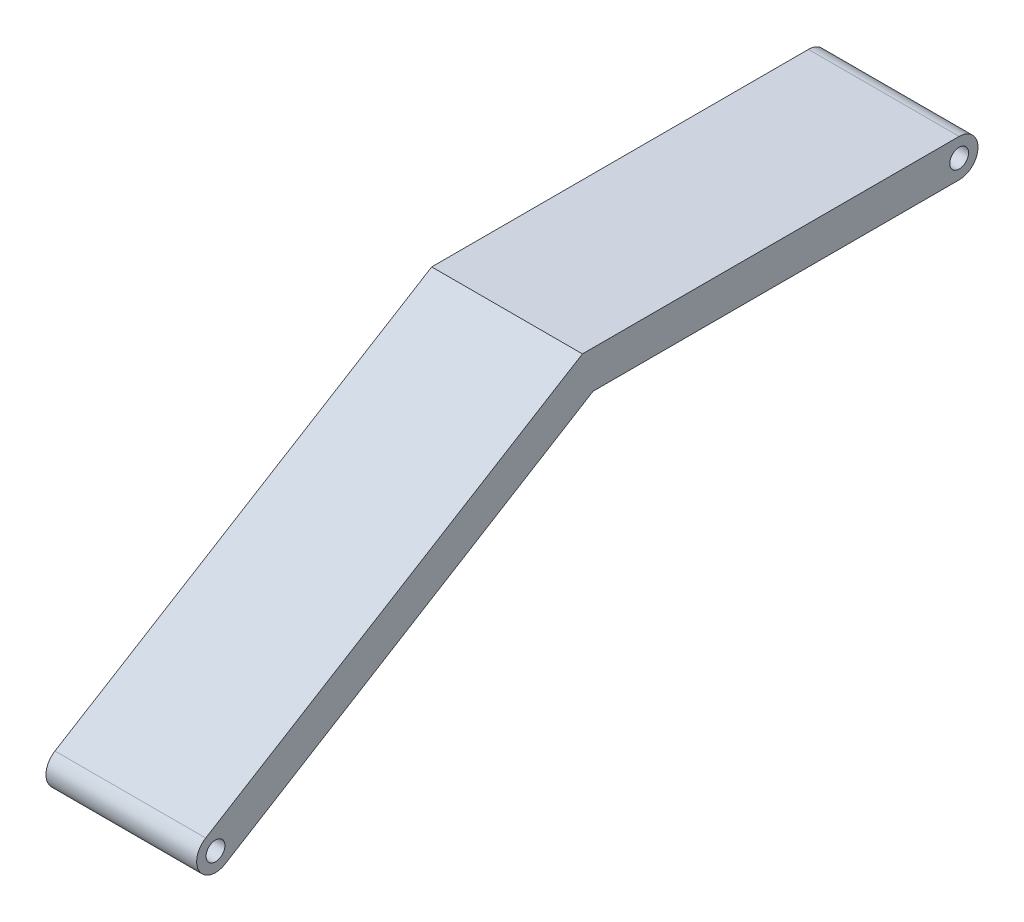
ISO-10303-21;
HEADER;
FILE_DESCRIPTION(('STEP AP214'),'2;1');
FILE_NAME('part.step','',(''),(''),'','','');
FILE_SCHEMA(('AUTOMOTIVE_DESIGN { 1 0 10303 214 1 1 1 1 }'));
ENDSEC;
DATA;
#1=APPLICATION_CONTEXT('core data for automotive mechanical design processes');
#2=APPLICATION_PROTOCOL_DEFINITION('international standard','automotive_design',2000,#1);
#3=PRODUCT_CONTEXT('',#1,'mechanical');
#4=PRODUCT('Part','Part','',(#3));
#5=PRODUCT_RELATED_PRODUCT_CATEGORY('part','',(#4));
#6=PRODUCT_DEFINITION_FORMATION('','',#4);
#7=PRODUCT_DEFINITION_CONTEXT('part definition',#1,'design');
#8=PRODUCT_DEFINITION('design','',#6,#7);
#9=PRODUCT_DEFINITION_SHAPE('','',#8);
#10=(LENGTH_UNIT() NAMED_UNIT(*) SI_UNIT(.MILLI.,.METRE.));
#11=(NAMED_UNIT(*) PLANE_ANGLE_UNIT() SI_UNIT($,.RADIAN.));
#12=(NAMED_UNIT(*) SI_UNIT($,.STERADIAN.) SOLID_ANGLE_UNIT());
#13=UNCERTAINTY_MEASURE_WITH_UNIT(LENGTH_MEASURE(1.E-05),#10,'distance_accuracy_value','');
#14=(GEOMETRIC_REPRESENTATION_CONTEXT(3) GLOBAL_UNCERTAINTY_ASSIGNED_CONTEXT((#13)) GLOBAL_UNIT_ASSIGNED_CONTEXT((#10,
#11,#12)) REPRESENTATION_CONTEXT('',''));
#15=CARTESIAN_POINT('',(0.,0.,0.));
#16=DIRECTION('',(0.,0.,1.));
#17=DIRECTION('',(1.,0.,0.));
#18=AXIS2_PLACEMENT_3D('',#15,#16,#17);
#19=CARTESIAN_POINT('',(4.,1.76861328752902,4.3260448331332));
#20=DIRECTION('',(0.,1.,0.));
#21=DIRECTION('',(0.,0.,1.));
#22=AXIS2_PLACEMENT_3D('',#19,#20,#21);
#23=PLANE('',#22);
#24=DIRECTION('',(0.,0.,-1.));
#25=VECTOR('',#24,1.);
#26=CARTESIAN_POINT('',(0.,1.76861328752902,4.3260448331332));
#27=LINE('',#26,#25);
#28=CARTESIAN_POINT('',(0.,1.76861328752902,4.3260448331332));
#29=VERTEX_POINT('',#28);
#30=CARTESIAN_POINT('',(0.,1.76861328752902,-5.67395516686681));
#31=VERTEX_POINT('',#30);
#32=EDGE_CURVE('E89',#29,#31,#27,.T.);
#33=ORIENTED_EDGE('',*,*,#32,.F.);
#34=DIRECTION('',(-1.,0.,0.));
#35=VECTOR('',#34,1.);
#36=CARTESIAN_POINT('',(4.,1.76861328752902,4.3260448331332));
#37=LINE('',#36,#35);
#38=CARTESIAN_POINT('',(4.,1.76861328752902,4.3260448331332));
#39=VERTEX_POINT('',#38);
#40=EDGE_CURVE('E49',#39,#29,#37,.T.);
#41=ORIENTED_EDGE('',*,*,#40,.F.);
#42=DIRECTION('',(0.,0.,-1.));
#43=VECTOR('',#42,1.);
#44=CARTESIAN_POINT('',(4.,1.76861328752902,4.3260448331332));
#45=LINE('',#44,#43);
#46=CARTESIAN_POINT('',(4.,1.76861328752902,-5.67395516686681));
#47=VERTEX_POINT('',#46);
#48=EDGE_CURVE('E108',#39,#47,#45,.T.);
#49=ORIENTED_EDGE('',*,*,#48,.T.);
#50=DIRECTION('',(-1.,0.,0.));
#51=VECTOR('',#50,1.);
#52=CARTESIAN_POINT('',(4.,1.76861328752902,-5.67395516686681));
#53=LINE('',#52,#51);
#54=EDGE_CURVE('E11',#47,#31,#53,.T.);
#55=ORIENTED_EDGE('',*,*,#54,.T.);
#56=EDGE_LOOP('',(#33,#41,#49,#55));
#57=FACE_BOUND('',#56,.T.);
#58=ADVANCED_FACE('F39',(#57),#23,.T.);
#59=CARTESIAN_POINT('',(4.,-4.35978996680547,14.3260448331332));
#60=DIRECTION('',(0.,0.852625145868333,0.522523071866691));
#61=DIRECTION('',(0.,-0.522523071866691,0.852625145868333));
#62=AXIS2_PLACEMENT_3D('',#59,#60,#61);
#63=PLANE('',#62);
#64=DIRECTION('',(0.,0.522523071866691,-0.852625145868333));
#65=VECTOR('',#64,1.);
#66=CARTESIAN_POINT('',(0.,-4.35978996680547,14.3260448331332));
#67=LINE('',#66,#65);
#68=CARTESIAN_POINT('',(0.,-4.35978996680547,14.3260448331332));
#69=VERTEX_POINT('',#68);
#70=EDGE_CURVE('E81',#69,#29,#67,.T.);
#71=ORIENTED_EDGE('',*,*,#70,.F.);
#72=DIRECTION('',(-1.,0.,0.));
#73=VECTOR('',#72,1.);
#74=CARTESIAN_POINT('',(4.,-4.35978996680547,14.3260448331332));
#75=LINE('',#74,#73);
#76=CARTESIAN_POINT('',(4.,-4.35978996680547,14.3260448331332));
#77=VERTEX_POINT('',#76);
#78=EDGE_CURVE('E85',#77,#69,#75,.T.);
#79=ORIENTED_EDGE('',*,*,#78,.F.);
#80=DIRECTION('',(0.,0.522523071866691,-0.852625145868333));
#81=VECTOR('',#80,1.);
#82=CARTESIAN_POINT('',(4.,-4.35978996680547,14.3260448331332));
#83=LINE('',#82,#81);
#84=EDGE_CURVE('E83',#77,#39,#83,.T.);
#85=ORIENTED_EDGE('',*,*,#84,.T.);
#86=ORIENTED_EDGE('',*,*,#40,.T.);
#87=EDGE_LOOP('',(#71,#79,#85,#86));
#88=FACE_BOUND('',#87,.T.);
#89=ADVANCED_FACE('F79',(#88),#63,.T.);
#90=CARTESIAN_POINT('',(4.,0.768613287529023,4.04400015019666));
#91=DIRECTION('',(0.,-0.852625145868333,-0.522523071866691));
#92=DIRECTION('',(0.,0.522523071866691,-0.852625145868333));
#93=AXIS2_PLACEMENT_3D('',#90,#91,#92);
#94=PLANE('',#93);
#95=DIRECTION('',(0.,-0.522523071866691,0.852625145868333));
#96=VECTOR('',#95,1.);
#97=CARTESIAN_POINT('',(0.,0.768613287529023,4.04400015019666));
#98=LINE('',#97,#96);
#99=CARTESIAN_POINT('',(0.,0.768613287529023,4.04400015019666));
#100=VERTEX_POINT('',#99);
#101=CARTESIAN_POINT('',(0.,-5.2124151126738,13.8035217612665));
#102=VERTEX_POINT('',#101);
#103=EDGE_CURVE('E90',#100,#102,#98,.T.);
#104=ORIENTED_EDGE('',*,*,#103,.F.);
#105=DIRECTION('',(-1.,0.,0.));
#106=VECTOR('',#105,1.);
#107=CARTESIAN_POINT('',(4.,0.768613287529023,4.04400015019666));
#108=LINE('',#107,#106);
#109=CARTESIAN_POINT('',(4.,0.768613287529023,4.04400015019666));
#110=VERTEX_POINT('',#109);
#111=EDGE_CURVE('E103',#110,#100,#108,.T.);
#112=ORIENTED_EDGE('',*,*,#111,.F.);
#113=DIRECTION('',(0.,-0.522523071866691,0.852625145868333));
#114=VECTOR('',#113,1.);
#115=CARTESIAN_POINT('',(4.,0.768613287529023,4.04400015019666));
#116=LINE('',#115,#114);
#117=CARTESIAN_POINT('',(4.,-5.2124151126738,13.8035217612665));
#118=VERTEX_POINT('',#117);
#119=EDGE_CURVE('E96',#110,#118,#116,.T.);
#120=ORIENTED_EDGE('',*,*,#119,.T.);
#121=DIRECTION('',(-1.,0.,0.));
#122=VECTOR('',#121,1.);
#123=CARTESIAN_POINT('',(4.,-5.2124151126738,13.8035217612665));
#124=LINE('',#123,#122);
#125=EDGE_CURVE('E101',#118,#102,#124,.T.);
#126=ORIENTED_EDGE('',*,*,#125,.T.);
#127=EDGE_LOOP('',(#104,#112,#120,#126));
#128=FACE_BOUND('',#127,.T.);
#129=ADVANCED_FACE('F125',(#128),#94,.T.);
#130=CARTESIAN_POINT('',(4.,0.768613287529024,-5.67395516686681));
#131=DIRECTION('',(0.,-1.,0.));
#132=DIRECTION('',(0.,0.,-1.));
#133=AXIS2_PLACEMENT_3D('',#130,#131,#132);
#134=PLANE('',#133);
#135=DIRECTION('',(0.,0.,1.));
#136=VECTOR('',#135,1.);
#137=CARTESIAN_POINT('',(0.,0.768613287529024,-5.67395516686681));
#138=LINE('',#137,#136);
#139=CARTESIAN_POINT('',(0.,0.768613287529024,-5.67395516686681));
#140=VERTEX_POINT('',#139);
#141=EDGE_CURVE('E118',#140,#100,#138,.T.);
#142=ORIENTED_EDGE('',*,*,#141,.F.);
#143=DIRECTION('',(-1.,0.,0.));
#144=VECTOR('',#143,1.);
#145=CARTESIAN_POINT('',(4.,0.768613287529024,-5.67395516686681));
#146=LINE('',#145,#144);
#147=CARTESIAN_POINT('',(4.,0.768613287529024,-5.67395516686681));
#148=VERTEX_POINT('',#147);
#149=EDGE_CURVE('E43',#148,#140,#146,.T.);
#150=ORIENTED_EDGE('',*,*,#149,.F.);
#151=DIRECTION('',(0.,0.,1.));
#152=VECTOR('',#151,1.);
#153=CARTESIAN_POINT('',(4.,0.768613287529024,-5.67395516686681));
#154=LINE('',#153,#152);
#155=EDGE_CURVE('E93',#148,#110,#154,.T.);
#156=ORIENTED_EDGE('',*,*,#155,.T.);
#157=ORIENTED_EDGE('',*,*,#111,.T.);
#158=EDGE_LOOP('',(#142,#150,#156,#157));
#159=FACE_BOUND('',#158,.T.);
#160=ADVANCED_FACE('F41',(#159),#134,.T.);
#161=CARTESIAN_POINT('',(4.,0.,0.));
#162=DIRECTION('',(-1.,0.,0.));
#163=DIRECTION('',(0.,0.,1.));
#164=AXIS2_PLACEMENT_3D('',#161,#162,#163);
#165=PLANE('',#164);
#166=CARTESIAN_POINT('',(4.,-4.78610253973963,14.0647832971998));
#167=DIRECTION('',(1.,0.,0.));
#168=DIRECTION('',(0.,0.,-1.));
#169=AXIS2_PLACEMENT_3D('',#166,#167,#168);
#170=CIRCLE('',#169,0.25);
#171=CARTESIAN_POINT('',(4.,-4.78610253973963,13.8147832971998));
#172=VERTEX_POINT('',#171);
#173=EDGE_CURVE('E189',#172,#172,#170,.T.);
#174=ORIENTED_EDGE('',*,*,#173,.F.);
#175=EDGE_LOOP('',(#174));
#176=FACE_BOUND('',#175,.T.);
#177=CARTESIAN_POINT('',(4.,1.26861328752902,-5.67395516686681));
#178=DIRECTION('',(1.,0.,0.));
#179=DIRECTION('',(0.,0.,-1.));
#180=AXIS2_PLACEMENT_3D('',#177,#178,#179);
#181=CIRCLE('',#180,0.25);
#182=CARTESIAN_POINT('',(4.,1.26861328752902,-5.92395516686681));
#183=VERTEX_POINT('',#182);
#184=EDGE_CURVE('E190',#183,#183,#181,.T.);
#185=ORIENTED_EDGE('',*,*,#184,.F.);
#186=EDGE_LOOP('',(#185));
#187=FACE_BOUND('',#186,.T.);
#188=ORIENTED_EDGE('',*,*,#155,.F.);
#189=CARTESIAN_POINT('',(4.,1.26861328752902,-5.67395516686681));
#190=DIRECTION('',(1.,0.,0.));
#191=DIRECTION('',(0.,0.,1.));
#192=AXIS2_PLACEMENT_3D('',#189,#190,#191);
#193=CIRCLE('',#192,0.5);
#194=EDGE_CURVE('E139',#148,#47,#193,.T.);
#195=ORIENTED_EDGE('',*,*,#194,.T.);
#196=ORIENTED_EDGE('',*,*,#48,.F.);
#197=ORIENTED_EDGE('',*,*,#84,.F.);
#198=CARTESIAN_POINT('',(4.,-4.78610253973963,14.0647832971998));
#199=DIRECTION('',(1.,0.,0.));
#200=DIRECTION('',(0.,0.,1.));
#201=AXIS2_PLACEMENT_3D('',#198,#199,#200);
#202=CIRCLE('',#201,0.5);
#203=EDGE_CURVE('E134',#77,#118,#202,.T.);
#204=ORIENTED_EDGE('',*,*,#203,.T.);
#205=ORIENTED_EDGE('',*,*,#119,.F.);
#206=EDGE_LOOP('',(#188,#195,#196,#197,#204,#205));
#207=FACE_BOUND('',#206,.T.);
#208=ADVANCED_FACE('F138',(#176,#187,#207),#165,.F.);
#209=CARTESIAN_POINT('',(0.,0.,0.));
#210=DIRECTION('',(-1.,0.,0.));
#211=DIRECTION('',(0.,0.,1.));
#212=AXIS2_PLACEMENT_3D('',#209,#210,#211);
#213=PLANE('',#212);
#214=CARTESIAN_POINT('',(0.,-4.78610253973963,14.0647832971998));
#215=DIRECTION('',(1.,0.,0.));
#216=DIRECTION('',(0.,0.,-1.));
#217=AXIS2_PLACEMENT_3D('',#214,#215,#216);
#218=CIRCLE('',#217,0.25);
#219=CARTESIAN_POINT('',(0.,-4.78610253973963,13.8147832971998));
#220=VERTEX_POINT('',#219);
#221=EDGE_CURVE('E143',#220,#220,#218,.T.);
#222=ORIENTED_EDGE('',*,*,#221,.T.);
#223=EDGE_LOOP('',(#222));
#224=FACE_BOUND('',#223,.T.);
#225=CARTESIAN_POINT('',(0.,1.26861328752902,-5.67395516686681));
#226=DIRECTION('',(1.,0.,0.));
#227=DIRECTION('',(0.,0.,-1.));
#228=AXIS2_PLACEMENT_3D('',#225,#226,#227);
#229=CIRCLE('',#228,0.25);
#230=CARTESIAN_POINT('',(0.,1.26861328752902,-5.92395516686681));
#231=VERTEX_POINT('',#230);
#232=EDGE_CURVE('E146',#231,#231,#229,.T.);
#233=ORIENTED_EDGE('',*,*,#232,.T.);
#234=EDGE_LOOP('',(#233));
#235=FACE_BOUND('',#234,.T.);
#236=ORIENTED_EDGE('',*,*,#32,.T.);
#237=CARTESIAN_POINT('',(0.,1.26861328752902,-5.67395516686681));
#238=DIRECTION('',(1.,0.,0.));
#239=DIRECTION('',(0.,0.,1.));
#240=AXIS2_PLACEMENT_3D('',#237,#238,#239);
#241=CIRCLE('',#240,0.5);
#242=EDGE_CURVE('E120',#140,#31,#241,.T.);
#243=ORIENTED_EDGE('',*,*,#242,.F.);
#244=ORIENTED_EDGE('',*,*,#141,.T.);
#245=ORIENTED_EDGE('',*,*,#103,.T.);
#246=CARTESIAN_POINT('',(0.,-4.78610253973963,14.0647832971998));
#247=DIRECTION('',(1.,0.,0.));
#248=DIRECTION('',(0.,0.,1.));
#249=AXIS2_PLACEMENT_3D('',#246,#247,#248);
#250=CIRCLE('',#249,0.5);
#251=EDGE_CURVE('E75',#69,#102,#250,.T.);
#252=ORIENTED_EDGE('',*,*,#251,.F.);
#253=ORIENTED_EDGE('',*,*,#70,.T.);
#254=EDGE_LOOP('',(#236,#243,#244,#245,#252,#253));
#255=FACE_BOUND('',#254,.T.);
#256=ADVANCED_FACE('F88',(#224,#235,#255),#213,.T.);
#257=CARTESIAN_POINT('',(0.,1.26861328752902,-5.67395516686681));
#258=DIRECTION('',(1.,0.,0.));
#259=DIRECTION('',(0.,0.,-1.));
#260=AXIS2_PLACEMENT_3D('',#257,#258,#259);
#261=CYLINDRICAL_SURFACE('',#260,0.5);
#262=ORIENTED_EDGE('',*,*,#194,.F.);
#263=ORIENTED_EDGE('',*,*,#149,.T.);
#264=ORIENTED_EDGE('',*,*,#242,.T.);
#265=ORIENTED_EDGE('',*,*,#54,.F.);
#266=EDGE_LOOP('',(#262,#263,#264,#265));
#267=FACE_BOUND('',#266,.T.);
#268=ADVANCED_FACE('F149',(#267),#261,.T.);
#269=CARTESIAN_POINT('',(0.,-4.78610253973963,14.0647832971998));
#270=DIRECTION('',(1.,0.,0.));
#271=DIRECTION('',(0.,0.,-1.));
#272=AXIS2_PLACEMENT_3D('',#269,#270,#271);
#273=CYLINDRICAL_SURFACE('',#272,0.5);
#274=ORIENTED_EDGE('',*,*,#203,.F.);
#275=ORIENTED_EDGE('',*,*,#78,.T.);
#276=ORIENTED_EDGE('',*,*,#251,.T.);
#277=ORIENTED_EDGE('',*,*,#125,.F.);
#278=EDGE_LOOP('',(#274,#275,#276,#277));
#279=FACE_BOUND('',#278,.T.);
#280=ADVANCED_FACE('F133',(#279),#273,.T.);
#281=CARTESIAN_POINT('',(0.,1.26861328752902,-5.67395516686681));
#282=DIRECTION('',(1.,0.,0.));
#283=DIRECTION('',(0.,0.,-1.));
#284=AXIS2_PLACEMENT_3D('',#281,#282,#283);
#285=CYLINDRICAL_SURFACE('',#284,0.25);
#286=ORIENTED_EDGE('',*,*,#232,.F.);
#287=EDGE_LOOP('',(#286));
#288=FACE_BOUND('',#287,.T.);
#289=ORIENTED_EDGE('',*,*,#184,.T.);
#290=EDGE_LOOP('',(#289));
#291=FACE_BOUND('',#290,.T.);
#292=ADVANCED_FACE('F175',(#288,#291),#285,.F.);
#293=CARTESIAN_POINT('',(0.,-4.78610253973963,14.0647832971998));
#294=DIRECTION('',(1.,0.,0.));
#295=DIRECTION('',(0.,0.,-1.));
#296=AXIS2_PLACEMENT_3D('',#293,#294,#295);
#297=CYLINDRICAL_SURFACE('',#296,0.25);
#298=ORIENTED_EDGE('',*,*,#221,.F.);
#299=EDGE_LOOP('',(#298));
#300=FACE_BOUND('',#299,.T.);
#301=ORIENTED_EDGE('',*,*,#173,.T.);
#302=EDGE_LOOP('',(#301));
#303=FACE_BOUND('',#302,.T.);
#304=ADVANCED_FACE('F178',(#300,#303),#297,.F.);
#305=CLOSED_SHELL('',(#58,#89,#129,#160,#208,#256,#268,#280,#292,#304));
#306=MANIFOLD_SOLID_BREP('B2',#305);
#307=ADVANCED_BREP_SHAPE_REPRESENTATION('',(#18,#306),#14);
#308=SHAPE_DEFINITION_REPRESENTATION(#9,#307);
ENDSEC;
END-ISO-10303-21;
